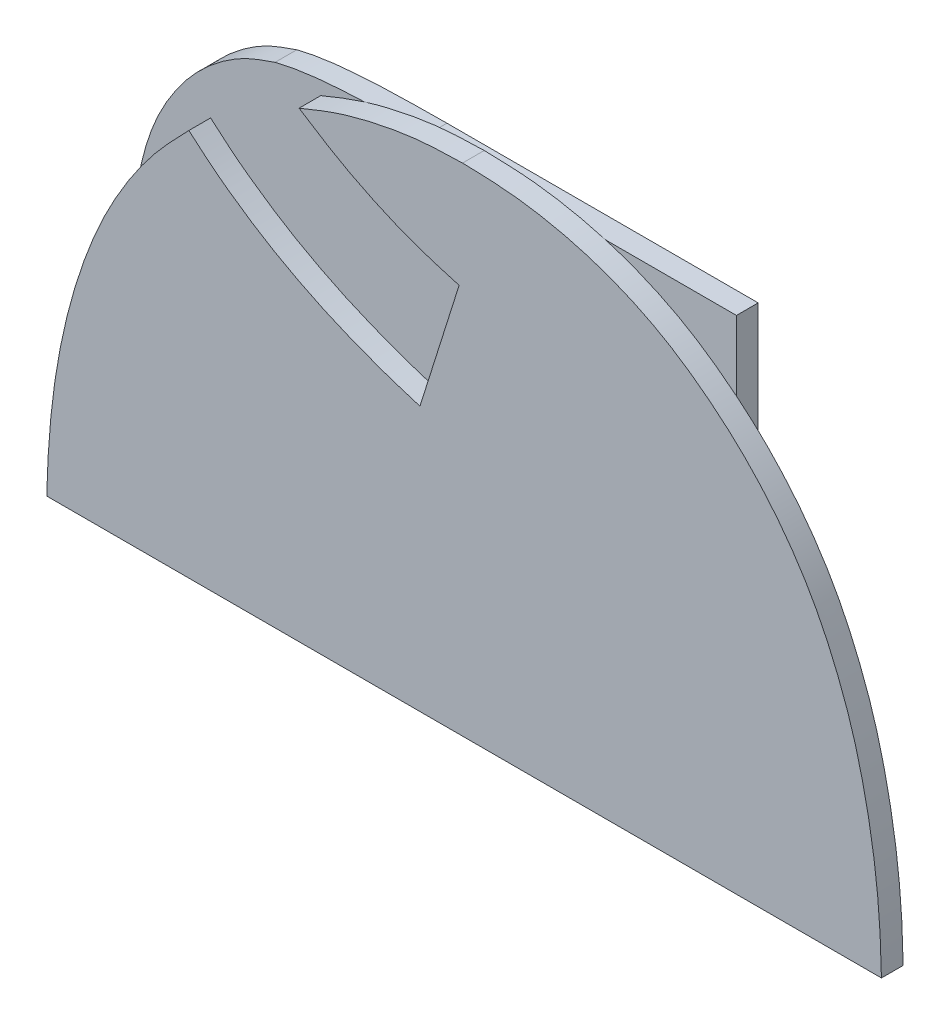
ISO-10303-21;
HEADER;
FILE_DESCRIPTION(('STEP AP214'),'2;1');
FILE_NAME('part.step','',(''),(''),'','','');
FILE_SCHEMA(('AUTOMOTIVE_DESIGN { 1 0 10303 214 1 1 1 1 }'));
ENDSEC;
DATA;
#1=APPLICATION_CONTEXT('core data for automotive mechanical design processes');
#2=APPLICATION_PROTOCOL_DEFINITION('international standard','automotive_design',2000,#1);
#3=PRODUCT_CONTEXT('',#1,'mechanical');
#4=PRODUCT('Part','Part','',(#3));
#5=PRODUCT_RELATED_PRODUCT_CATEGORY('part','',(#4));
#6=PRODUCT_DEFINITION_FORMATION('','',#4);
#7=PRODUCT_DEFINITION_CONTEXT('part definition',#1,'design');
#8=PRODUCT_DEFINITION('design','',#6,#7);
#9=PRODUCT_DEFINITION_SHAPE('','',#8);
#10=(LENGTH_UNIT() NAMED_UNIT(*) SI_UNIT(.MILLI.,.METRE.));
#11=(NAMED_UNIT(*) PLANE_ANGLE_UNIT() SI_UNIT($,.RADIAN.));
#12=(NAMED_UNIT(*) SI_UNIT($,.STERADIAN.) SOLID_ANGLE_UNIT());
#13=UNCERTAINTY_MEASURE_WITH_UNIT(LENGTH_MEASURE(1.E-05),#10,'distance_accuracy_value','');
#14=(GEOMETRIC_REPRESENTATION_CONTEXT(3) GLOBAL_UNCERTAINTY_ASSIGNED_CONTEXT((#13)) GLOBAL_UNIT_ASSIGNED_CONTEXT((#10,
#11,#12)) REPRESENTATION_CONTEXT('',''));
#15=CARTESIAN_POINT('',(0.,0.,0.));
#16=DIRECTION('',(0.,0.,1.));
#17=DIRECTION('',(1.,0.,0.));
#18=AXIS2_PLACEMENT_3D('',#15,#16,#17);
#19=CARTESIAN_POINT('',(-17.,0.5,1.));
#20=DIRECTION('',(0.,1.,0.));
#21=DIRECTION('',(0.,0.,1.));
#22=AXIS2_PLACEMENT_3D('',#19,#20,#21);
#23=PLANE('',#22);
#24=DIRECTION('',(0.,0.,1.));
#25=VECTOR('',#24,1.);
#26=CARTESIAN_POINT('',(9.99087380576317,0.5,0.5));
#27=LINE('',#26,#25);
#28=CARTESIAN_POINT('',(9.99087380597482,0.499999990243459,1.));
#29=VERTEX_POINT('',#28);
#30=CARTESIAN_POINT('',(9.99087380597482,0.499999990243459,0.5));
#31=VERTEX_POINT('',#30);
#32=EDGE_CURVE('E92',#29,#31,#27,.F.);
#33=ORIENTED_EDGE('',*,*,#32,.F.);
#34=DIRECTION('',(1.,0.,0.));
#35=VECTOR('',#34,1.);
#36=CARTESIAN_POINT('',(-17.,0.5,1.));
#37=LINE('',#36,#35);
#38=CARTESIAN_POINT('',(-9.21865830529896,0.499999990247548,1.));
#39=VERTEX_POINT('',#38);
#40=EDGE_CURVE('E43',#39,#29,#37,.T.);
#41=ORIENTED_EDGE('',*,*,#40,.F.);
#42=DIRECTION('',(0.,0.,1.));
#43=VECTOR('',#42,1.);
#44=CARTESIAN_POINT('',(-9.21865830504152,0.5,0.5));
#45=LINE('',#44,#43);
#46=CARTESIAN_POINT('',(-9.21865830529896,0.499999990247548,0.5));
#47=VERTEX_POINT('',#46);
#48=EDGE_CURVE('E225',#47,#39,#45,.T.);
#49=ORIENTED_EDGE('',*,*,#48,.F.);
#50=DIRECTION('',(-1.,0.,0.));
#51=VECTOR('',#50,1.);
#52=CARTESIAN_POINT('',(-17.,0.5,0.5));
#53=LINE('',#52,#51);
#54=EDGE_CURVE('E127',#31,#47,#53,.T.);
#55=ORIENTED_EDGE('',*,*,#54,.F.);
#56=EDGE_LOOP('',(#33,#41,#49,#55));
#57=FACE_BOUND('',#56,.T.);
#58=ADVANCED_FACE('F39',(#57),#23,.F.);
#59=CARTESIAN_POINT('',(0.,0.,1.));
#60=DIRECTION('',(0.,0.,-1.));
#61=DIRECTION('',(-1.,0.,0.));
#62=AXIS2_PLACEMENT_3D('',#59,#60,#61);
#63=PLANE('',#62);
#64=CARTESIAN_POINT('',(-0.63100961538462,6.58653846153846,1.));
#65=CARTESIAN_POINT('',(-0.894319671134255,6.66803744267736,1.));
#66=CARTESIAN_POINT('',(-1.41502985426516,6.82920618069991,1.));
#67=CARTESIAN_POINT('',(-2.16813237873717,7.11271262365866,1.));
#68=CARTESIAN_POINT('',(-2.89054022736661,7.41845518055138,1.));
#69=CARTESIAN_POINT('',(-3.57092248636074,7.76113766295311,1.));
#70=CARTESIAN_POINT('',(-4.22144770913973,8.12832644716513,1.));
#71=CARTESIAN_POINT('',(-4.83039467529682,8.53225031230209,1.));
#72=CARTESIAN_POINT('',(-5.41253203412093,8.95640226796856,1.));
#73=CARTESIAN_POINT('',(-5.77133339907765,9.26822255770492,1.));
#74=CARTESIAN_POINT('',(-5.94951923076923,9.42307692307692,1.));
#75=B_SPLINE_CURVE_WITH_KNOTS('',3,(#64,#65,#66,#67,#68,#69,#70,#71,#72,#73,#74),.UNSPECIFIED.,
.F.,.F.,(4,1,1,1,1,1,1,1,4),(0.,0.136020898301321,0.268988841548293,0.397000820882357,
0.52302316466143,0.64480443078414,0.765468728430669,0.883528454003217,1.),.UNSPECIFIED.);
#76=CARTESIAN_POINT('',(-0.63100961538462,6.58653846153846,1.));
#77=VERTEX_POINT('',#76);
#78=CARTESIAN_POINT('',(-5.94951923076923,9.42307692307692,1.));
#79=VERTEX_POINT('',#78);
#80=EDGE_CURVE('E162',#77,#79,#75,.T.);
#81=ORIENTED_EDGE('',*,*,#80,.T.);
#82=CARTESIAN_POINT('',(-5.94951923076923,9.42307692307692,1.));
#83=CARTESIAN_POINT('',(-6.21339353106539,9.15102080343158,1.));
#84=CARTESIAN_POINT('',(-6.74350021905969,8.60447736069422,1.));
#85=CARTESIAN_POINT('',(-7.41029581302277,7.65841943132263,1.));
#86=CARTESIAN_POINT('',(-7.97857306160017,6.62075798482048,1.));
#87=CARTESIAN_POINT('',(-8.43343144317379,5.47860993740602,1.));
#88=CARTESIAN_POINT('',(-8.79336837355103,4.24314577309855,1.));
#89=CARTESIAN_POINT('',(-9.050810047283,2.90759580353337,1.));
#90=CARTESIAN_POINT('',(-9.19861625487089,1.47369380087417,1.));
#91=CARTESIAN_POINT('',(-9.21983868962944,0.485122001942624,1.));
#92=CARTESIAN_POINT('',(-9.23076923076923,-0.0240384615384625,1.));
#93=B_SPLINE_CURVE_WITH_KNOTS('',3,(#82,#83,#84,#85,#86,#87,#88,#89,#90,#91,#92),.UNSPECIFIED.,
.F.,.F.,(4,1,1,1,1,1,1,1,4),(0.,0.110462276308717,0.221911688165935,0.336496788692268,
0.455039818437065,0.579907747375789,0.71152433155377,0.851421611249838,1.),.UNSPECIFIED.);
#94=EDGE_CURVE('E155',#79,#39,#93,.T.);
#95=ORIENTED_EDGE('',*,*,#94,.T.);
#96=ORIENTED_EDGE('',*,*,#40,.T.);
#97=CARTESIAN_POINT('',(10.,0.,1.));
#98=CARTESIAN_POINT('',(9.9922792013081,0.467014057872968,1.));
#99=CARTESIAN_POINT('',(9.97730448483657,1.37280157856109,1.));
#100=CARTESIAN_POINT('',(9.85158071000492,2.69117608092411,1.));
#101=CARTESIAN_POINT('',(9.63384343863532,3.92365530492593,1.));
#102=CARTESIAN_POINT('',(9.34554905740699,5.07886684818043,1.));
#103=CARTESIAN_POINT('',(8.95708699602344,6.14518844517494,1.));
#104=CARTESIAN_POINT('',(8.49707536101354,7.13419261451192,1.));
#105=CARTESIAN_POINT('',(7.94070220651536,8.03447107253892,1.));
#106=CARTESIAN_POINT('',(7.30253401757682,8.84588556284268,1.));
#107=CARTESIAN_POINT('',(6.59977786799587,9.56752298930225,1.));
#108=CARTESIAN_POINT('',(5.84390717476958,10.194167751821,1.));
#109=CARTESIAN_POINT('',(5.04937942384997,10.7364560293608,1.));
#110=CARTESIAN_POINT('',(4.19881378747112,11.1719859807892,1.));
#111=CARTESIAN_POINT('',(3.30086595430551,11.508275036905,1.));
#112=CARTESIAN_POINT('',(2.35785953735712,11.7481374579581,1.));
#113=CARTESIAN_POINT('',(1.36893698318586,11.8972655077949,1.));
#114=CARTESIAN_POINT('',(0.693646802548687,11.9143475825137,1.));
#115=CARTESIAN_POINT('',(0.34855769230769,11.9230769230769,1.));
#116=B_SPLINE_CURVE_WITH_KNOTS('',3,(#97,#98,#99,#100,#101,#102,#103,#104,#105,#106,#107,#108,
#109,#110,#111,#112,#113,#114,#115),.UNSPECIFIED.,.F.,.F.,(4,1,1,1,1,1,1,1,1,1,1,1,1,1,1,1,4),
(0.,0.0810326621300396,0.157165234939228,0.229518397457671,0.298064470604454,0.363492405304042,
0.426159072652892,0.487032782037051,0.546699482760247,0.604960279723965,0.661486145143537,
0.716828091605148,0.771554126409179,0.826887338001704,0.882870803772946,0.940144235369899,1.),.UNSPECIFIED.);
#117=CARTESIAN_POINT('',(0.34855769230769,11.9230769230769,1.));
#118=VERTEX_POINT('',#117);
#119=EDGE_CURVE('E136',#29,#118,#116,.T.);
#120=ORIENTED_EDGE('',*,*,#119,.T.);
#121=CARTESIAN_POINT('',(0.34855769230769,11.9230769230769,1.));
#122=CARTESIAN_POINT('',(0.0193452359396035,11.9148843529333,1.));
#123=CARTESIAN_POINT('',(-0.630599722610887,11.8987102393498,1.));
#124=CARTESIAN_POINT('',(-1.59000664115034,11.7376437849044,1.));
#125=CARTESIAN_POINT('',(-2.52369149856271,11.5000166192497,1.));
#126=CARTESIAN_POINT('',(-3.11736668310616,11.2570144009192,1.));
#127=CARTESIAN_POINT('',(-3.41346153846154,11.1358173076923,1.));
#128=B_SPLINE_CURVE_WITH_KNOTS('',3,(#121,#122,#123,#124,#125,#126,#127),.UNSPECIFIED.,.F.,.F.,
(4,1,1,1,4),(0.,0.254952441716652,0.503337741202005,0.752290236297546,1.),.UNSPECIFIED.);
#129=CARTESIAN_POINT('',(-3.41346153846154,11.1358173076923,1.));
#130=VERTEX_POINT('',#129);
#131=EDGE_CURVE('E132',#118,#130,#128,.T.);
#132=ORIENTED_EDGE('',*,*,#131,.T.);
#133=CARTESIAN_POINT('',(-3.41346153846154,11.1358173076923,1.));
#134=CARTESIAN_POINT('',(-3.12193255975835,10.9485047593671,1.));
#135=CARTESIAN_POINT('',(-2.54231838442725,10.5760923538847,1.));
#136=CARTESIAN_POINT('',(-1.62869956752675,10.1109285131715,1.));
#137=CARTESIAN_POINT('',(-0.692808404415679,9.72462489088026,1.));
#138=CARTESIAN_POINT('',(-0.0500473457026729,9.53944559915724,1.));
#139=CARTESIAN_POINT('',(0.270432692307688,9.44711538461538,1.));
#140=B_SPLINE_CURVE_WITH_KNOTS('',3,(#133,#134,#135,#136,#137,#138,#139),.UNSPECIFIED.,.F.,.F.,
(4,1,1,1,4),(0.,0.255212241850166,0.507409705039965,0.754394958573845,1.),.UNSPECIFIED.);
#141=CARTESIAN_POINT('',(0.270432692307688,9.44711538461538,1.));
#142=VERTEX_POINT('',#141);
#143=EDGE_CURVE('E120',#130,#142,#140,.T.);
#144=ORIENTED_EDGE('',*,*,#143,.T.);
#145=DIRECTION('',(-0.300555941545493,-0.953764187837697,0.));
#146=VECTOR('',#145,1.);
#147=CARTESIAN_POINT('',(0.270432692307688,9.44711538461538,1.));
#148=LINE('',#147,#146);
#149=EDGE_CURVE('E128',#142,#77,#148,.T.);
#150=ORIENTED_EDGE('',*,*,#149,.T.);
#151=EDGE_LOOP('',(#81,#95,#96,#120,#132,#144,#150));
#152=FACE_BOUND('',#151,.T.);
#153=ADVANCED_FACE('F135',(#152),#63,.F.);
#154=CARTESIAN_POINT('',(-2.86670923646913,14.9469507429344,0.5));
#155=DIRECTION('',(0.,0.,-1.));
#156=DIRECTION('',(-1.,0.,0.));
#157=AXIS2_PLACEMENT_3D('',#154,#155,#156);
#158=PLANE('',#157);
#159=CARTESIAN_POINT('',(-5.94951923076923,9.42307692307692,0.5));
#160=CARTESIAN_POINT('',(-6.21339353106539,9.15102080343158,0.5));
#161=CARTESIAN_POINT('',(-6.74350021905969,8.60447736069422,0.5));
#162=CARTESIAN_POINT('',(-7.41029581302277,7.65841943132263,0.5));
#163=CARTESIAN_POINT('',(-7.97857306160017,6.62075798482048,0.5));
#164=CARTESIAN_POINT('',(-8.43343144317379,5.47860993740602,0.5));
#165=CARTESIAN_POINT('',(-8.79336837355103,4.24314577309855,0.5));
#166=CARTESIAN_POINT('',(-9.050810047283,2.90759580353337,0.5));
#167=CARTESIAN_POINT('',(-9.19861625487089,1.47369380087417,0.5));
#168=CARTESIAN_POINT('',(-9.21983868962944,0.485122001942624,0.5));
#169=CARTESIAN_POINT('',(-9.23076923076923,-0.0240384615384625,0.5));
#170=B_SPLINE_CURVE_WITH_KNOTS('',3,(#159,#160,#161,#162,#163,#164,#165,#166,#167,#168,#169),
.UNSPECIFIED.,.F.,.F.,(4,1,1,1,1,1,1,1,4),(0.,0.110462276308717,0.221911688165935,
0.336496788692268,0.455039818437065,0.579907747375789,0.71152433155377,0.851421611249838,1.),.UNSPECIFIED.);
#171=CARTESIAN_POINT('',(-7.62834612093452,7.24709567802628,0.5));
#172=VERTEX_POINT('',#171);
#173=EDGE_CURVE('E211',#172,#47,#170,.T.);
#174=ORIENTED_EDGE('',*,*,#173,.F.);
#175=CARTESIAN_POINT('',(-7.69230769230768,6.25600961538461,0.5));
#176=CARTESIAN_POINT('',(-7.68334578057861,6.56140199861163,0.5));
#177=CARTESIAN_POINT('',(-7.66598072463034,7.15314581189967,0.5));
#178=CARTESIAN_POINT('',(-7.49102346242659,8.00464693690172,0.5));
#179=CARTESIAN_POINT('',(-7.21672743718203,8.79144907391843,0.5));
#180=CARTESIAN_POINT('',(-6.82401624933714,9.49865557974401,0.5));
#181=CARTESIAN_POINT('',(-6.34872148278842,10.1190640458932,0.5));
#182=CARTESIAN_POINT('',(-5.79002255792669,10.6266602933011,0.5));
#183=CARTESIAN_POINT('',(-5.16583151627625,11.0324647862556,0.5));
#184=CARTESIAN_POINT('',(-4.69978079816894,11.1931435757386,0.5));
#185=CARTESIAN_POINT('',(-4.46514423076921,11.2740384615385,0.5));
#186=B_SPLINE_CURVE_WITH_KNOTS('',3,(#175,#176,#177,#178,#179,#180,#181,#182,#183,#184,#185),
.UNSPECIFIED.,.F.,.F.,(4,1,1,1,1,1,1,1,4),(0.,0.14289460138112,0.27687984692363,
0.405406725510109,0.531833372930009,0.654224986869887,0.769810940790896,0.884109671743148,1.),.UNSPECIFIED.);
#187=CARTESIAN_POINT('',(-7.69230769230768,6.25600961538461,0.5));
#188=VERTEX_POINT('',#187);
#189=EDGE_CURVE('E324',#188,#172,#186,.T.);
#190=ORIENTED_EDGE('',*,*,#189,.F.);
#191=CARTESIAN_POINT('',(-1.08173076923075,0.769230769230767,0.5));
#192=CARTESIAN_POINT('',(-1.37031400962702,0.774055990655361,0.5));
#193=CARTESIAN_POINT('',(-1.92624287782716,0.783351332552924,0.5));
#194=CARTESIAN_POINT('',(-2.72953473754154,0.848219277515443,0.5));
#195=CARTESIAN_POINT('',(-3.46675844790728,0.960502700280922,0.5));
#196=CARTESIAN_POINT('',(-4.1399590019052,1.11710520157451,0.5));
#197=CARTESIAN_POINT('',(-4.74999360264593,1.31175761566908,0.5));
#198=CARTESIAN_POINT('',(-5.29577077219165,1.55793934225839,0.5));
#199=CARTESIAN_POINT('',(-5.77447610888803,1.85324831203823,0.5));
#200=CARTESIAN_POINT('',(-6.18928163394163,2.19467530029792,0.5));
#201=CARTESIAN_POINT('',(-6.54534536535054,2.57715682541306,0.5));
#202=CARTESIAN_POINT('',(-6.85386612407712,2.99442305852459,0.5));
#203=CARTESIAN_POINT('',(-7.11600203735596,3.44945584013187,0.5));
#204=CARTESIAN_POINT('',(-7.32148561626384,3.94415898642623,0.5));
#205=CARTESIAN_POINT('',(-7.4955585376525,4.46890955858489,0.5));
#206=CARTESIAN_POINT('',(-7.60421146642071,5.03458042255102,0.5));
#207=CARTESIAN_POINT('',(-7.67975750639046,5.63296852000707,0.5));
#208=CARTESIAN_POINT('',(-7.68806564119163,6.04541734277417,0.5));
#209=CARTESIAN_POINT('',(-7.69230769230768,6.25600961538461,0.5));
#210=B_SPLINE_CURVE_WITH_KNOTS('',3,(#191,#192,#193,#194,#195,#196,#197,#198,#199,#200,#201,
#202,#203,#204,#205,#206,#207,#208,#209),.UNSPECIFIED.,.F.,.F.,(4,1,1,1,1,1,1,1,1,1,1,1,1,1,1,1,
4),(0.,0.0877310226443747,0.169005684660541,0.244802144396213,0.314231761771564,
0.378941580520446,0.439171854935432,0.49578670264117,0.549434768970673,0.602000335423469,
0.654254525291273,0.706904693032372,0.761202146387593,0.816862306733052,0.874669995750775,
0.936007744563197,1.),.UNSPECIFIED.);
#211=CARTESIAN_POINT('',(-1.08173076923075,0.769230769230767,0.5));
#212=VERTEX_POINT('',#211);
#213=EDGE_CURVE('E410',#212,#188,#210,.T.);
#214=ORIENTED_EDGE('',*,*,#213,.F.);
#215=DIRECTION('',(-1.,0.,0.));
#216=VECTOR('',#215,1.);
#217=CARTESIAN_POINT('',(6.15384615384617,0.769230769230767,0.5));
#218=LINE('',#217,#216);
#219=CARTESIAN_POINT('',(6.15384615384617,0.769230769230767,0.5));
#220=VERTEX_POINT('',#219);
#221=EDGE_CURVE('E267',#220,#212,#218,.T.);
#222=ORIENTED_EDGE('',*,*,#221,.F.);
#223=DIRECTION('',(0.,-1.,0.));
#224=VECTOR('',#223,1.);
#225=CARTESIAN_POINT('',(6.15384615384617,11.5384615384615,0.5));
#226=LINE('',#225,#224);
#227=CARTESIAN_POINT('',(6.15384615384617,9.93169518687201,0.5));
#228=VERTEX_POINT('',#227);
#229=EDGE_CURVE('E261',#228,#220,#226,.T.);
#230=ORIENTED_EDGE('',*,*,#229,.F.);
#231=CARTESIAN_POINT('',(10.,0.,0.5));
#232=CARTESIAN_POINT('',(9.9922792013081,0.467014057872968,0.5));
#233=CARTESIAN_POINT('',(9.97730448483657,1.37280157856109,0.5));
#234=CARTESIAN_POINT('',(9.85158071000492,2.69117608092411,0.5));
#235=CARTESIAN_POINT('',(9.63384343863532,3.92365530492593,0.5));
#236=CARTESIAN_POINT('',(9.34554905740699,5.07886684818043,0.5));
#237=CARTESIAN_POINT('',(8.95708699602344,6.14518844517494,0.5));
#238=CARTESIAN_POINT('',(8.49707536101354,7.13419261451192,0.5));
#239=CARTESIAN_POINT('',(7.94070220651536,8.03447107253892,0.500000000000001));
#240=CARTESIAN_POINT('',(7.30253401757682,8.84588556284268,0.5));
#241=CARTESIAN_POINT('',(6.59977786799587,9.56752298930225,0.5));
#242=CARTESIAN_POINT('',(5.84390717476958,10.194167751821,0.5));
#243=CARTESIAN_POINT('',(5.04937942384997,10.7364560293608,0.5));
#244=CARTESIAN_POINT('',(4.19881378747112,11.1719859807892,0.5));
#245=CARTESIAN_POINT('',(3.30086595430551,11.508275036905,0.5));
#246=CARTESIAN_POINT('',(2.35785953735712,11.7481374579581,0.5));
#247=CARTESIAN_POINT('',(1.36893698318586,11.8972655077949,0.5));
#248=CARTESIAN_POINT('',(0.693646802548687,11.9143475825137,0.5));
#249=CARTESIAN_POINT('',(0.34855769230769,11.9230769230769,0.5));
#250=B_SPLINE_CURVE_WITH_KNOTS('',3,(#231,#232,#233,#234,#235,#236,#237,#238,#239,#240,#241,
#242,#243,#244,#245,#246,#247,#248,#249),.UNSPECIFIED.,.F.,.F.,(4,1,1,1,1,1,1,1,1,1,1,1,1,1,1,1,
4),(0.,0.0810326621300396,0.157165234939228,0.229518397457671,0.298064470604454,
0.363492405304042,0.426159072652892,0.487032782037051,0.546699482760247,0.604960279723965,
0.661486145143537,0.716828091605148,0.771554126409179,0.826887338001704,0.882870803772946,
0.940144235369899,1.),.UNSPECIFIED.);
#251=EDGE_CURVE('E212',#31,#228,#250,.T.);
#252=ORIENTED_EDGE('',*,*,#251,.F.);
#253=ORIENTED_EDGE('',*,*,#54,.T.);
#254=EDGE_LOOP('',(#174,#190,#214,#222,#230,#252,#253));
#255=FACE_BOUND('',#254,.T.);
#256=ADVANCED_FACE('F191',(#255),#158,.T.);
#257=CARTESIAN_POINT('',(3.14088854018955,11.5384615384615,0.5));
#258=VERTEX_POINT('',#257);
#259=CARTESIAN_POINT('',(0.34855769230769,11.9230769230769,0.5));
#260=VERTEX_POINT('',#259);
#261=EDGE_CURVE('E86',#258,#260,#250,.T.);
#262=ORIENTED_EDGE('',*,*,#261,.F.);
#263=DIRECTION('',(1.,0.,0.));
#264=VECTOR('',#263,1.);
#265=CARTESIAN_POINT('',(-1.00961538461537,11.5384615384615,0.5));
#266=LINE('',#265,#264);
#267=CARTESIAN_POINT('',(-1.00961538461537,11.5384615384615,0.5));
#268=VERTEX_POINT('',#267);
#269=EDGE_CURVE('E308',#268,#258,#266,.T.);
#270=ORIENTED_EDGE('',*,*,#269,.F.);
#271=CARTESIAN_POINT('',(-4.46514423076921,11.2740384615385,0.5));
#272=CARTESIAN_POINT('',(-4.3792128004865,11.295050594988,0.5));
#273=CARTESIAN_POINT('',(-4.19247789431203,11.3407114056522,0.5));
#274=CARTESIAN_POINT('',(-3.88315298428619,11.3925371140144,0.5));
#275=CARTESIAN_POINT('',(-3.5246617109382,11.441611456393,0.5));
#276=CARTESIAN_POINT('',(-3.11525660846265,11.4741699984362,0.5));
#277=CARTESIAN_POINT('',(-2.6586713489867,11.5065047734513,0.5));
#278=CARTESIAN_POINT('',(-2.15351009433788,11.5214102993299,0.5));
#279=CARTESIAN_POINT('',(-1.59862210032687,11.53428442385,0.5));
#280=CARTESIAN_POINT('',(-1.21194937368708,11.5370266273822,0.5));
#281=CARTESIAN_POINT('',(-1.00961538461537,11.5384615384615,0.5));
#282=B_SPLINE_CURVE_WITH_KNOTS('',3,(#271,#272,#273,#274,#275,#276,#277,#278,#279,#280,#281),
.UNSPECIFIED.,.F.,.F.,(4,1,1,1,1,1,1,1,4),(0.,0.0763829976036969,0.165985505465532,
0.270714880261737,0.388824082683411,0.520601870042667,0.666029478257653,0.825243459802021,1.),.UNSPECIFIED.);
#283=CARTESIAN_POINT('',(-2.40892376020777,11.5134120992012,0.5));
#284=VERTEX_POINT('',#283);
#285=EDGE_CURVE('E301',#284,#268,#282,.T.);
#286=ORIENTED_EDGE('',*,*,#285,.F.);
#287=CARTESIAN_POINT('',(0.34855769230769,11.9230769230769,0.5));
#288=CARTESIAN_POINT('',(0.0193452359396035,11.9148843529333,0.5));
#289=CARTESIAN_POINT('',(-0.630599722610887,11.8987102393498,0.5));
#290=CARTESIAN_POINT('',(-1.59000664115034,11.7376437849044,0.5));
#291=CARTESIAN_POINT('',(-2.52369149856271,11.5000166192497,0.5));
#292=CARTESIAN_POINT('',(-3.11736668310616,11.2570144009192,0.5));
#293=CARTESIAN_POINT('',(-3.41346153846154,11.1358173076923,0.5));
#294=B_SPLINE_CURVE_WITH_KNOTS('',3,(#287,#288,#289,#290,#291,#292,#293),.UNSPECIFIED.,.F.,.F.,
(4,1,1,1,4),(0.,0.254952441716652,0.503337741202005,0.752290236297546,1.),.UNSPECIFIED.);
#295=EDGE_CURVE('E121',#260,#284,#294,.T.);
#296=ORIENTED_EDGE('',*,*,#295,.F.);
#297=EDGE_LOOP('',(#262,#270,#286,#296));
#298=FACE_BOUND('',#297,.T.);
#299=ADVANCED_FACE('F199',(#298),#158,.T.);
#300=CARTESIAN_POINT('',(6.15384615384617,11.5384615384615,0.5));
#301=DIRECTION('',(1.,0.,0.));
#302=DIRECTION('',(0.,0.,-1.));
#303=AXIS2_PLACEMENT_3D('',#300,#301,#302);
#304=PLANE('',#303);
#305=DIRECTION('',(0.,-1.,0.));
#306=VECTOR('',#305,1.);
#307=CARTESIAN_POINT('',(6.15384615384617,11.5384615384615,0.));
#308=LINE('',#307,#306);
#309=CARTESIAN_POINT('',(6.15384615384617,11.5384615384615,0.));
#310=VERTEX_POINT('',#309);
#311=CARTESIAN_POINT('',(6.15384615384617,0.769230769230767,0.));
#312=VERTEX_POINT('',#311);
#313=EDGE_CURVE('E354',#310,#312,#308,.T.);
#314=ORIENTED_EDGE('',*,*,#313,.F.);
#315=DIRECTION('',(0.,0.,-1.));
#316=VECTOR('',#315,1.);
#317=CARTESIAN_POINT('',(6.15384615384617,11.5384615384615,0.5));
#318=LINE('',#317,#316);
#319=CARTESIAN_POINT('',(6.15384615384617,11.5384615384615,0.5));
#320=VERTEX_POINT('',#319);
#321=EDGE_CURVE('E282',#320,#310,#318,.T.);
#322=ORIENTED_EDGE('',*,*,#321,.F.);
#323=EDGE_CURVE('E272',#320,#228,#226,.T.);
#324=ORIENTED_EDGE('',*,*,#323,.T.);
#325=ORIENTED_EDGE('',*,*,#229,.T.);
#326=DIRECTION('',(0.,0.,-1.));
#327=VECTOR('',#326,1.);
#328=CARTESIAN_POINT('',(6.15384615384617,0.769230769230767,0.5));
#329=LINE('',#328,#327);
#330=EDGE_CURVE('E273',#220,#312,#329,.T.);
#331=ORIENTED_EDGE('',*,*,#330,.T.);
#332=EDGE_LOOP('',(#314,#322,#324,#325,#331));
#333=FACE_BOUND('',#332,.T.);
#334=ADVANCED_FACE('F278',(#333),#304,.T.);
#335=CARTESIAN_POINT('',(-1.00961538461537,11.5384615384615,0.5));
#336=DIRECTION('',(0.,1.,0.));
#337=DIRECTION('',(0.,0.,1.));
#338=AXIS2_PLACEMENT_3D('',#335,#336,#337);
#339=PLANE('',#338);
#340=DIRECTION('',(1.,0.,0.));
#341=VECTOR('',#340,1.);
#342=CARTESIAN_POINT('',(-1.00961538461537,11.5384615384615,0.));
#343=LINE('',#342,#341);
#344=CARTESIAN_POINT('',(-1.00961538461537,11.5384615384615,0.));
#345=VERTEX_POINT('',#344);
#346=EDGE_CURVE('E346',#345,#310,#343,.T.);
#347=ORIENTED_EDGE('',*,*,#346,.F.);
#348=DIRECTION('',(0.,0.,-1.));
#349=VECTOR('',#348,1.);
#350=CARTESIAN_POINT('',(-1.00961538461537,11.5384615384615,0.5));
#351=LINE('',#350,#349);
#352=EDGE_CURVE('E307',#268,#345,#351,.T.);
#353=ORIENTED_EDGE('',*,*,#352,.F.);
#354=ORIENTED_EDGE('',*,*,#269,.T.);
#355=EDGE_CURVE('E320',#258,#320,#266,.T.);
#356=ORIENTED_EDGE('',*,*,#355,.T.);
#357=ORIENTED_EDGE('',*,*,#321,.T.);
#358=EDGE_LOOP('',(#347,#353,#354,#356,#357));
#359=FACE_BOUND('',#358,.T.);
#360=ADVANCED_FACE('F337',(#359),#339,.T.);
#361=DIRECTION('',(0.,0.,-1.));
#362=VECTOR('',#361,1.);
#363=SURFACE_OF_LINEAR_EXTRUSION('',#282,#362);
#364=CARTESIAN_POINT('',(-4.46514423076921,11.2740384615385,0.));
#365=CARTESIAN_POINT('',(-4.3792128004865,11.295050594988,0.));
#366=CARTESIAN_POINT('',(-4.19247789431203,11.3407114056522,0.));
#367=CARTESIAN_POINT('',(-3.88315298428619,11.3925371140144,0.));
#368=CARTESIAN_POINT('',(-3.5246617109382,11.441611456393,0.));
#369=CARTESIAN_POINT('',(-3.11525660846265,11.4741699984362,0.));
#370=CARTESIAN_POINT('',(-2.6586713489867,11.5065047734513,0.));
#371=CARTESIAN_POINT('',(-2.15351009433788,11.5214102993299,0.));
#372=CARTESIAN_POINT('',(-1.59862210032687,11.53428442385,0.));
#373=CARTESIAN_POINT('',(-1.21194937368708,11.5370266273822,0.));
#374=CARTESIAN_POINT('',(-1.00961538461537,11.5384615384615,0.));
#375=B_SPLINE_CURVE_WITH_KNOTS('',3,(#364,#365,#366,#367,#368,#369,#370,#371,#372,#373,#374),
.UNSPECIFIED.,.F.,.F.,(4,1,1,1,1,1,1,1,4),(0.,0.0763829976036969,0.165985505465532,
0.270714880261737,0.388824082683411,0.520601870042667,0.666029478257653,0.825243459802021,1.),.UNSPECIFIED.);
#376=CARTESIAN_POINT('',(-4.46514423076921,11.2740384615385,0.));
#377=VERTEX_POINT('',#376);
#378=EDGE_CURVE('E286',#377,#345,#375,.T.);
#379=ORIENTED_EDGE('',*,*,#378,.F.);
#380=DIRECTION('',(0.,0.,-1.));
#381=VECTOR('',#380,1.);
#382=CARTESIAN_POINT('',(-4.46514423076921,11.2740384615385,0.5));
#383=LINE('',#382,#381);
#384=CARTESIAN_POINT('',(-4.46514423076921,11.2740384615385,0.5));
#385=VERTEX_POINT('',#384);
#386=EDGE_CURVE('E316',#385,#377,#383,.T.);
#387=ORIENTED_EDGE('',*,*,#386,.F.);
#388=EDGE_CURVE('E293',#385,#284,#282,.T.);
#389=ORIENTED_EDGE('',*,*,#388,.T.);
#390=ORIENTED_EDGE('',*,*,#285,.T.);
#391=ORIENTED_EDGE('',*,*,#352,.T.);
#392=EDGE_LOOP('',(#379,#387,#389,#390,#391));
#393=FACE_BOUND('',#392,.T.);
#394=ADVANCED_FACE('F312',(#393),#363,.T.);
#395=DIRECTION('',(0.,0.,-1.));
#396=VECTOR('',#395,1.);
#397=SURFACE_OF_LINEAR_EXTRUSION('',#186,#396);
#398=CARTESIAN_POINT('',(-7.69230769230768,6.25600961538461,0.));
#399=CARTESIAN_POINT('',(-7.68334578057861,6.56140199861163,0.));
#400=CARTESIAN_POINT('',(-7.66598072463034,7.15314581189967,0.));
#401=CARTESIAN_POINT('',(-7.49102346242659,8.00464693690172,0.));
#402=CARTESIAN_POINT('',(-7.21672743718203,8.79144907391843,0.));
#403=CARTESIAN_POINT('',(-6.82401624933714,9.49865557974401,0.));
#404=CARTESIAN_POINT('',(-6.34872148278842,10.1190640458932,0.));
#405=CARTESIAN_POINT('',(-5.79002255792669,10.6266602933011,0.));
#406=CARTESIAN_POINT('',(-5.16583151627625,11.0324647862556,0.));
#407=CARTESIAN_POINT('',(-4.69978079816894,11.1931435757386,0.));
#408=CARTESIAN_POINT('',(-4.46514423076921,11.2740384615385,0.));
#409=B_SPLINE_CURVE_WITH_KNOTS('',3,(#398,#399,#400,#401,#402,#403,#404,#405,#406,#407,#408),
.UNSPECIFIED.,.F.,.F.,(4,1,1,1,1,1,1,1,4),(0.,0.14289460138112,0.27687984692363,
0.405406725510109,0.531833372930009,0.654224986869887,0.769810940790896,0.884109671743148,1.),.UNSPECIFIED.);
#410=CARTESIAN_POINT('',(-7.69230769230768,6.25600961538461,0.));
#411=VERTEX_POINT('',#410);
#412=EDGE_CURVE('E361',#411,#377,#409,.T.);
#413=ORIENTED_EDGE('',*,*,#412,.F.);
#414=DIRECTION('',(0.,0.,-1.));
#415=VECTOR('',#414,1.);
#416=CARTESIAN_POINT('',(-7.69230769230768,6.25600961538461,0.5));
#417=LINE('',#416,#415);
#418=EDGE_CURVE('E404',#188,#411,#417,.T.);
#419=ORIENTED_EDGE('',*,*,#418,.F.);
#420=ORIENTED_EDGE('',*,*,#189,.T.);
#421=EDGE_CURVE('E407',#172,#385,#186,.T.);
#422=ORIENTED_EDGE('',*,*,#421,.T.);
#423=ORIENTED_EDGE('',*,*,#386,.T.);
#424=EDGE_LOOP('',(#413,#419,#420,#422,#423));
#425=FACE_BOUND('',#424,.T.);
#426=ADVANCED_FACE('F333',(#425),#397,.T.);
#427=DIRECTION('',(0.,0.,-1.));
#428=VECTOR('',#427,1.);
#429=SURFACE_OF_LINEAR_EXTRUSION('',#210,#428);
#430=CARTESIAN_POINT('',(-1.08173076923075,0.769230769230767,0.));
#431=CARTESIAN_POINT('',(-1.37031400962702,0.774055990655361,0.));
#432=CARTESIAN_POINT('',(-1.92624287782716,0.783351332552924,0.));
#433=CARTESIAN_POINT('',(-2.72953473754154,0.848219277515443,0.));
#434=CARTESIAN_POINT('',(-3.46675844790728,0.960502700280922,0.));
#435=CARTESIAN_POINT('',(-4.1399590019052,1.11710520157451,0.));
#436=CARTESIAN_POINT('',(-4.74999360264593,1.31175761566908,0.));
#437=CARTESIAN_POINT('',(-5.29577077219165,1.55793934225839,0.));
#438=CARTESIAN_POINT('',(-5.77447610888803,1.85324831203823,0.));
#439=CARTESIAN_POINT('',(-6.18928163394163,2.19467530029792,0.));
#440=CARTESIAN_POINT('',(-6.54534536535054,2.57715682541306,0.));
#441=CARTESIAN_POINT('',(-6.85386612407712,2.99442305852459,0.));
#442=CARTESIAN_POINT('',(-7.11600203735596,3.44945584013187,0.));
#443=CARTESIAN_POINT('',(-7.32148561626384,3.94415898642623,0.));
#444=CARTESIAN_POINT('',(-7.4955585376525,4.46890955858489,0.));
#445=CARTESIAN_POINT('',(-7.60421146642071,5.03458042255102,0.));
#446=CARTESIAN_POINT('',(-7.67975750639046,5.63296852000707,0.));
#447=CARTESIAN_POINT('',(-7.68806564119163,6.04541734277417,0.));
#448=CARTESIAN_POINT('',(-7.69230769230768,6.25600961538461,0.));
#449=B_SPLINE_CURVE_WITH_KNOTS('',3,(#430,#431,#432,#433,#434,#435,#436,#437,#438,#439,#440,
#441,#442,#443,#444,#445,#446,#447,#448),.UNSPECIFIED.,.F.,.F.,(4,1,1,1,1,1,1,1,1,1,1,1,1,1,1,1,
4),(0.,0.0877310226443747,0.169005684660541,0.244802144396213,0.314231761771564,
0.378941580520446,0.439171854935432,0.49578670264117,0.549434768970673,0.602000335423469,
0.654254525291273,0.706904693032372,0.761202146387593,0.816862306733052,0.874669995750775,
0.936007744563197,1.),.UNSPECIFIED.);
#450=CARTESIAN_POINT('',(-1.08173076923075,0.769230769230767,0.));
#451=VERTEX_POINT('',#450);
#452=EDGE_CURVE('E363',#451,#411,#449,.T.);
#453=ORIENTED_EDGE('',*,*,#452,.F.);
#454=DIRECTION('',(0.,0.,-1.));
#455=VECTOR('',#454,1.);
#456=CARTESIAN_POINT('',(-1.08173076923075,0.769230769230767,0.5));
#457=LINE('',#456,#455);
#458=EDGE_CURVE('E352',#212,#451,#457,.T.);
#459=ORIENTED_EDGE('',*,*,#458,.F.);
#460=ORIENTED_EDGE('',*,*,#213,.T.);
#461=ORIENTED_EDGE('',*,*,#418,.T.);
#462=EDGE_LOOP('',(#453,#459,#460,#461));
#463=FACE_BOUND('',#462,.T.);
#464=ADVANCED_FACE('F420',(#463),#429,.T.);
#465=CARTESIAN_POINT('',(6.15384615384617,0.769230769230767,0.5));
#466=DIRECTION('',(0.,-1.,0.));
#467=DIRECTION('',(0.,0.,-1.));
#468=AXIS2_PLACEMENT_3D('',#465,#466,#467);
#469=PLANE('',#468);
#470=DIRECTION('',(-1.,0.,0.));
#471=VECTOR('',#470,1.);
#472=CARTESIAN_POINT('',(6.15384615384617,0.769230769230767,0.));
#473=LINE('',#472,#471);
#474=EDGE_CURVE('E376',#312,#451,#473,.T.);
#475=ORIENTED_EDGE('',*,*,#474,.F.);
#476=ORIENTED_EDGE('',*,*,#330,.F.);
#477=ORIENTED_EDGE('',*,*,#221,.T.);
#478=ORIENTED_EDGE('',*,*,#458,.T.);
#479=EDGE_LOOP('',(#475,#476,#477,#478));
#480=FACE_BOUND('',#479,.T.);
#481=ADVANCED_FACE('F195',(#480),#469,.T.);
#482=CARTESIAN_POINT('',(0.,0.,0.));
#483=DIRECTION('',(0.,0.,-1.));
#484=DIRECTION('',(-1.,0.,0.));
#485=AXIS2_PLACEMENT_3D('',#482,#483,#484);
#486=PLANE('',#485);
#487=ORIENTED_EDGE('',*,*,#346,.T.);
#488=ORIENTED_EDGE('',*,*,#313,.T.);
#489=ORIENTED_EDGE('',*,*,#474,.T.);
#490=ORIENTED_EDGE('',*,*,#452,.T.);
#491=ORIENTED_EDGE('',*,*,#412,.T.);
#492=ORIENTED_EDGE('',*,*,#378,.T.);
#493=EDGE_LOOP('',(#487,#488,#489,#490,#491,#492));
#494=FACE_BOUND('',#493,.T.);
#495=ADVANCED_FACE('F187',(#494),#486,.T.);
#496=DIRECTION('',(0.,0.,1.));
#497=VECTOR('',#496,1.);
#498=SURFACE_OF_LINEAR_EXTRUSION('',#170,#497);
#499=ORIENTED_EDGE('',*,*,#48,.T.);
#500=ORIENTED_EDGE('',*,*,#94,.F.);
#501=DIRECTION('',(0.,0.,1.));
#502=VECTOR('',#501,1.);
#503=CARTESIAN_POINT('',(-5.94951923076923,9.42307692307692,0.5));
#504=LINE('',#503,#502);
#505=CARTESIAN_POINT('',(-5.94951923076923,9.42307692307692,0.5));
#506=VERTEX_POINT('',#505);
#507=EDGE_CURVE('E11',#506,#79,#504,.T.);
#508=ORIENTED_EDGE('',*,*,#507,.F.);
#509=EDGE_CURVE('E235',#506,#172,#170,.T.);
#510=ORIENTED_EDGE('',*,*,#509,.T.);
#511=ORIENTED_EDGE('',*,*,#173,.T.);
#512=EDGE_LOOP('',(#499,#500,#508,#510,#511));
#513=FACE_BOUND('',#512,.T.);
#514=ADVANCED_FACE('F192',(#513),#498,.T.);
#515=DIRECTION('',(0.,0.,1.));
#516=VECTOR('',#515,1.);
#517=SURFACE_OF_LINEAR_EXTRUSION('',#250,#516);
#518=ORIENTED_EDGE('',*,*,#32,.T.);
#519=ORIENTED_EDGE('',*,*,#251,.T.);
#520=EDGE_CURVE('E254',#228,#258,#250,.T.);
#521=ORIENTED_EDGE('',*,*,#520,.T.);
#522=ORIENTED_EDGE('',*,*,#261,.T.);
#523=DIRECTION('',(0.,0.,1.));
#524=VECTOR('',#523,1.);
#525=CARTESIAN_POINT('',(0.34855769230769,11.9230769230769,0.5));
#526=LINE('',#525,#524);
#527=EDGE_CURVE('E252',#260,#118,#526,.T.);
#528=ORIENTED_EDGE('',*,*,#527,.T.);
#529=ORIENTED_EDGE('',*,*,#119,.F.);
#530=EDGE_LOOP('',(#518,#519,#521,#522,#528,#529));
#531=FACE_BOUND('',#530,.T.);
#532=ADVANCED_FACE('F247',(#531),#517,.T.);
#533=CARTESIAN_POINT('',(-12.3982386079212,6.27826392564542,0.5));
#534=DIRECTION('',(0.,0.,1.));
#535=DIRECTION('',(1.,0.,0.));
#536=AXIS2_PLACEMENT_3D('',#533,#534,#535);
#537=PLANE('',#536);
#538=ORIENTED_EDGE('',*,*,#421,.F.);
#539=ORIENTED_EDGE('',*,*,#509,.F.);
#540=CARTESIAN_POINT('',(-0.63100961538462,6.58653846153846,0.5));
#541=CARTESIAN_POINT('',(-0.894319671134255,6.66803744267736,0.5));
#542=CARTESIAN_POINT('',(-1.41502985426516,6.82920618069991,0.5));
#543=CARTESIAN_POINT('',(-2.16813237873717,7.11271262365866,0.5));
#544=CARTESIAN_POINT('',(-2.89054022736661,7.41845518055138,0.5));
#545=CARTESIAN_POINT('',(-3.57092248636074,7.76113766295311,0.5));
#546=CARTESIAN_POINT('',(-4.22144770913973,8.12832644716513,0.5));
#547=CARTESIAN_POINT('',(-4.83039467529682,8.53225031230209,0.5));
#548=CARTESIAN_POINT('',(-5.41253203412093,8.95640226796856,0.5));
#549=CARTESIAN_POINT('',(-5.77133339907765,9.26822255770492,0.5));
#550=CARTESIAN_POINT('',(-5.94951923076923,9.42307692307692,0.5));
#551=B_SPLINE_CURVE_WITH_KNOTS('',3,(#540,#541,#542,#543,#544,#545,#546,#547,#548,#549,#550),
.UNSPECIFIED.,.F.,.F.,(4,1,1,1,1,1,1,1,4),(0.,0.136020898301321,0.268988841548293,
0.397000820882357,0.52302316466143,0.64480443078414,0.765468728430669,0.883528454003217,1.),.UNSPECIFIED.);
#552=CARTESIAN_POINT('',(-0.63100961538462,6.58653846153846,0.5));
#553=VERTEX_POINT('',#552);
#554=EDGE_CURVE('E48',#553,#506,#551,.T.);
#555=ORIENTED_EDGE('',*,*,#554,.F.);
#556=DIRECTION('',(-0.300555941545493,-0.953764187837697,0.));
#557=VECTOR('',#556,1.);
#558=CARTESIAN_POINT('',(0.270432692307688,9.44711538461538,0.5));
#559=LINE('',#558,#557);
#560=CARTESIAN_POINT('',(0.270432692307688,9.44711538461538,0.5));
#561=VERTEX_POINT('',#560);
#562=EDGE_CURVE('E237',#561,#553,#559,.T.);
#563=ORIENTED_EDGE('',*,*,#562,.F.);
#564=CARTESIAN_POINT('',(-3.41346153846154,11.1358173076923,0.5));
#565=CARTESIAN_POINT('',(-3.12193255975835,10.9485047593671,0.5));
#566=CARTESIAN_POINT('',(-2.54231838442725,10.5760923538847,0.5));
#567=CARTESIAN_POINT('',(-1.62869956752675,10.1109285131715,0.5));
#568=CARTESIAN_POINT('',(-0.692808404415679,9.72462489088026,0.5));
#569=CARTESIAN_POINT('',(-0.0500473457026729,9.53944559915724,0.5));
#570=CARTESIAN_POINT('',(0.270432692307688,9.44711538461538,0.5));
#571=B_SPLINE_CURVE_WITH_KNOTS('',3,(#564,#565,#566,#567,#568,#569,#570),.UNSPECIFIED.,.F.,.F.,
(4,1,1,1,4),(0.,0.255212241850166,0.507409705039965,0.754394958573845,1.),.UNSPECIFIED.);
#572=CARTESIAN_POINT('',(-3.41346153846154,11.1358173076923,0.5));
#573=VERTEX_POINT('',#572);
#574=EDGE_CURVE('E123',#573,#561,#571,.T.);
#575=ORIENTED_EDGE('',*,*,#574,.F.);
#576=EDGE_CURVE('E230',#284,#573,#294,.T.);
#577=ORIENTED_EDGE('',*,*,#576,.F.);
#578=ORIENTED_EDGE('',*,*,#388,.F.);
#579=EDGE_LOOP('',(#538,#539,#555,#563,#575,#577,#578));
#580=FACE_BOUND('',#579,.T.);
#581=ADVANCED_FACE('F41',(#580),#537,.T.);
#582=ORIENTED_EDGE('',*,*,#520,.F.);
#583=ORIENTED_EDGE('',*,*,#323,.F.);
#584=ORIENTED_EDGE('',*,*,#355,.F.);
#585=EDGE_LOOP('',(#582,#583,#584));
#586=FACE_BOUND('',#585,.T.);
#587=ADVANCED_FACE('F397',(#586),#537,.T.);
#588=CARTESIAN_POINT('',(0.270432692307688,9.44711538461538,0.5));
#589=DIRECTION('',(-0.953764187837697,0.300555941545493,0.));
#590=DIRECTION('',(-0.300555941545493,-0.953764187837697,0.));
#591=AXIS2_PLACEMENT_3D('',#588,#589,#590);
#592=PLANE('',#591);
#593=ORIENTED_EDGE('',*,*,#149,.F.);
#594=DIRECTION('',(0.,0.,1.));
#595=VECTOR('',#594,1.);
#596=CARTESIAN_POINT('',(0.270432692307688,9.44711538461538,0.5));
#597=LINE('',#596,#595);
#598=EDGE_CURVE('E113',#561,#142,#597,.T.);
#599=ORIENTED_EDGE('',*,*,#598,.F.);
#600=ORIENTED_EDGE('',*,*,#562,.T.);
#601=DIRECTION('',(0.,0.,1.));
#602=VECTOR('',#601,1.);
#603=CARTESIAN_POINT('',(-0.63100961538462,6.58653846153846,0.5));
#604=LINE('',#603,#602);
#605=EDGE_CURVE('E57',#553,#77,#604,.T.);
#606=ORIENTED_EDGE('',*,*,#605,.T.);
#607=EDGE_LOOP('',(#593,#599,#600,#606));
#608=FACE_BOUND('',#607,.T.);
#609=ADVANCED_FACE('F130',(#608),#592,.T.);
#610=DIRECTION('',(0.,0.,1.));
#611=VECTOR('',#610,1.);
#612=SURFACE_OF_LINEAR_EXTRUSION('',#571,#611);
#613=ORIENTED_EDGE('',*,*,#143,.F.);
#614=DIRECTION('',(0.,0.,1.));
#615=VECTOR('',#614,1.);
#616=CARTESIAN_POINT('',(-3.41346153846154,11.1358173076923,0.5));
#617=LINE('',#616,#615);
#618=EDGE_CURVE('E63',#573,#130,#617,.T.);
#619=ORIENTED_EDGE('',*,*,#618,.F.);
#620=ORIENTED_EDGE('',*,*,#574,.T.);
#621=ORIENTED_EDGE('',*,*,#598,.T.);
#622=EDGE_LOOP('',(#613,#619,#620,#621));
#623=FACE_BOUND('',#622,.T.);
#624=ADVANCED_FACE('F117',(#623),#612,.T.);
#625=DIRECTION('',(0.,0.,1.));
#626=VECTOR('',#625,1.);
#627=SURFACE_OF_LINEAR_EXTRUSION('',#294,#626);
#628=ORIENTED_EDGE('',*,*,#131,.F.);
#629=ORIENTED_EDGE('',*,*,#527,.F.);
#630=ORIENTED_EDGE('',*,*,#295,.T.);
#631=ORIENTED_EDGE('',*,*,#576,.T.);
#632=ORIENTED_EDGE('',*,*,#618,.T.);
#633=EDGE_LOOP('',(#628,#629,#630,#631,#632));
#634=FACE_BOUND('',#633,.T.);
#635=ADVANCED_FACE('F186',(#634),#627,.T.);
#636=DIRECTION('',(0.,0.,1.));
#637=VECTOR('',#636,1.);
#638=SURFACE_OF_LINEAR_EXTRUSION('',#551,#637);
#639=ORIENTED_EDGE('',*,*,#80,.F.);
#640=ORIENTED_EDGE('',*,*,#605,.F.);
#641=ORIENTED_EDGE('',*,*,#554,.T.);
#642=ORIENTED_EDGE('',*,*,#507,.T.);
#643=EDGE_LOOP('',(#639,#640,#641,#642));
#644=FACE_BOUND('',#643,.T.);
#645=ADVANCED_FACE('F222',(#644),#638,.T.);
#646=CLOSED_SHELL('',(#58,#153,#256,#299,#334,#360,#394,#426,#464,#481,#495,#514,#532,#581,#587,
#609,#624,#635,#645));
#647=MANIFOLD_SOLID_BREP('B2',#646);
#648=ADVANCED_BREP_SHAPE_REPRESENTATION('',(#18,#647),#14);
#649=SHAPE_DEFINITION_REPRESENTATION(#9,#648);
ENDSEC;
END-ISO-10303-21;
